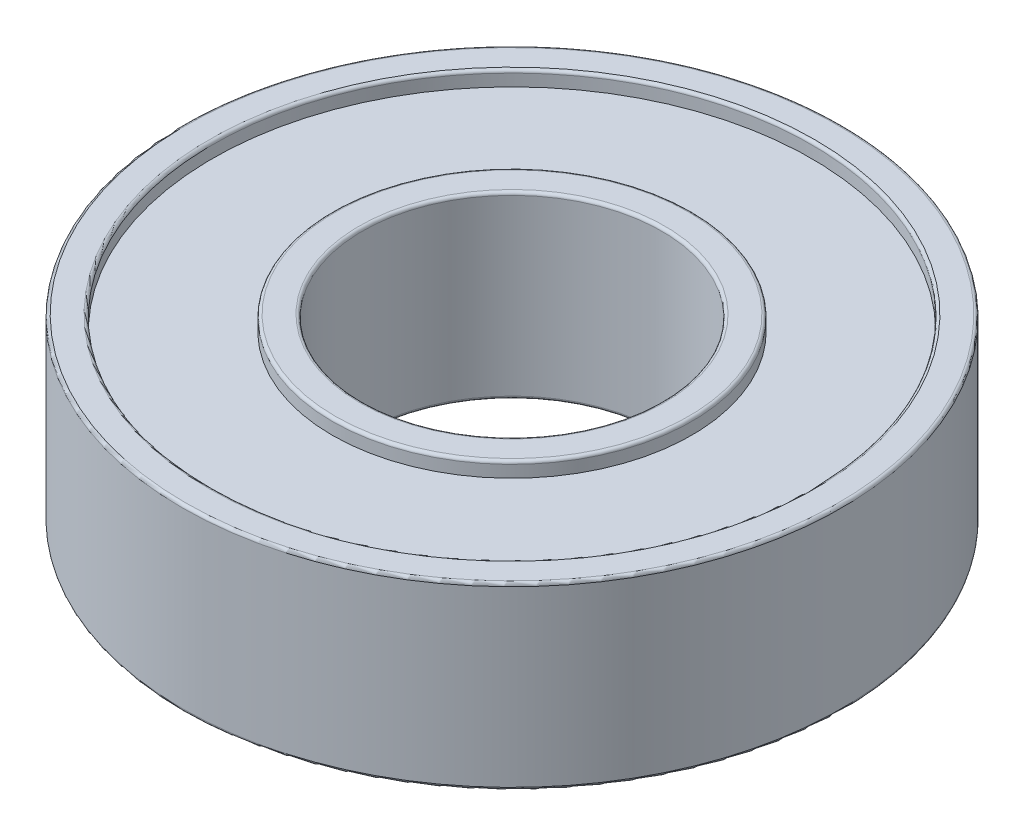
ISO-10303-21;
HEADER;
FILE_DESCRIPTION(('STEP AP214'),'2;1');
FILE_NAME('part.step','',(''),(''),'','','');
FILE_SCHEMA(('AUTOMOTIVE_DESIGN { 1 0 10303 214 1 1 1 1 }'));
ENDSEC;
DATA;
#1=APPLICATION_CONTEXT('core data for automotive mechanical design processes');
#2=APPLICATION_PROTOCOL_DEFINITION('international standard','automotive_design',2000,#1);
#3=PRODUCT_CONTEXT('',#1,'mechanical');
#4=PRODUCT('Part','Part','',(#3));
#5=PRODUCT_RELATED_PRODUCT_CATEGORY('part','',(#4));
#6=PRODUCT_DEFINITION_FORMATION('','',#4);
#7=PRODUCT_DEFINITION_CONTEXT('part definition',#1,'design');
#8=PRODUCT_DEFINITION('design','',#6,#7);
#9=PRODUCT_DEFINITION_SHAPE('','',#8);
#10=(LENGTH_UNIT() NAMED_UNIT(*) SI_UNIT(.MILLI.,.METRE.));
#11=(NAMED_UNIT(*) PLANE_ANGLE_UNIT() SI_UNIT($,.RADIAN.));
#12=(NAMED_UNIT(*) SI_UNIT($,.STERADIAN.) SOLID_ANGLE_UNIT());
#13=UNCERTAINTY_MEASURE_WITH_UNIT(LENGTH_MEASURE(1.E-05),#10,'distance_accuracy_value','');
#14=(GEOMETRIC_REPRESENTATION_CONTEXT(3) GLOBAL_UNCERTAINTY_ASSIGNED_CONTEXT((#13)) GLOBAL_UNIT_ASSIGNED_CONTEXT((#10,
#11,#12)) REPRESENTATION_CONTEXT('',''));
#15=CARTESIAN_POINT('',(0.,0.,0.));
#16=DIRECTION('',(0.,0.,1.));
#17=DIRECTION('',(1.,0.,0.));
#18=AXIS2_PLACEMENT_3D('',#15,#16,#17);
#19=CARTESIAN_POINT('',(0.,2.9,0.));
#20=DIRECTION('',(0.,1.,0.));
#21=DIRECTION('',(0.,0.,1.));
#22=AXIS2_PLACEMENT_3D('',#19,#20,#21);
#23=TOROIDAL_SURFACE('',#22,5.1,0.1);
#24=CARTESIAN_POINT('',(0.,3.,0.));
#25=DIRECTION('',(0.,1.,0.));
#26=DIRECTION('',(0.,0.,1.));
#27=AXIS2_PLACEMENT_3D('',#24,#25,#26);
#28=CIRCLE('',#27,5.1);
#29=CARTESIAN_POINT('',(0.,3.,5.1));
#30=VERTEX_POINT('',#29);
#31=EDGE_CURVE('E10',#30,#30,#28,.T.);
#32=ORIENTED_EDGE('',*,*,#31,.T.);
#33=EDGE_LOOP('',(#32));
#34=FACE_BOUND('',#33,.T.);
#35=CARTESIAN_POINT('',(0.,2.9,0.));
#36=DIRECTION('',(0.,1.,0.));
#37=DIRECTION('',(0.,0.,1.));
#38=AXIS2_PLACEMENT_3D('',#35,#36,#37);
#39=CIRCLE('',#38,5.);
#40=CARTESIAN_POINT('',(0.,2.9,5.));
#41=VERTEX_POINT('',#40);
#42=EDGE_CURVE('E101',#41,#41,#39,.T.);
#43=ORIENTED_EDGE('',*,*,#42,.F.);
#44=EDGE_LOOP('',(#43));
#45=FACE_BOUND('',#44,.T.);
#46=ADVANCED_FACE('F37',(#34,#45),#23,.T.);
#47=CARTESIAN_POINT('',(5.1,3.,0.));
#48=DIRECTION('',(0.,1.,0.));
#49=DIRECTION('',(0.,0.,1.));
#50=AXIS2_PLACEMENT_3D('',#47,#48,#49);
#51=PLANE('',#50);
#52=CARTESIAN_POINT('',(0.,3.,0.));
#53=DIRECTION('',(0.,1.,0.));
#54=DIRECTION('',(0.,0.,1.));
#55=AXIS2_PLACEMENT_3D('',#52,#53,#54);
#56=CIRCLE('',#55,5.9);
#57=CARTESIAN_POINT('',(0.,3.,5.9));
#58=VERTEX_POINT('',#57);
#59=EDGE_CURVE('E43',#58,#58,#56,.T.);
#60=ORIENTED_EDGE('',*,*,#59,.T.);
#61=EDGE_LOOP('',(#60));
#62=FACE_BOUND('',#61,.T.);
#63=ORIENTED_EDGE('',*,*,#31,.F.);
#64=EDGE_LOOP('',(#63));
#65=FACE_BOUND('',#64,.T.);
#66=ADVANCED_FACE('F109',(#62,#65),#51,.T.);
#67=CARTESIAN_POINT('',(0.,2.9,0.));
#68=DIRECTION('',(0.,1.,0.));
#69=DIRECTION('',(0.,0.,1.));
#70=AXIS2_PLACEMENT_3D('',#67,#68,#69);
#71=TOROIDAL_SURFACE('',#70,5.9,0.1);
#72=CARTESIAN_POINT('',(0.,2.9,0.));
#73=DIRECTION('',(0.,1.,0.));
#74=DIRECTION('',(0.,0.,1.));
#75=AXIS2_PLACEMENT_3D('',#72,#73,#74);
#76=CIRCLE('',#75,6.);
#77=CARTESIAN_POINT('',(0.,2.9,6.));
#78=VERTEX_POINT('',#77);
#79=EDGE_CURVE('E47',#78,#78,#76,.T.);
#80=ORIENTED_EDGE('',*,*,#79,.T.);
#81=EDGE_LOOP('',(#80));
#82=FACE_BOUND('',#81,.T.);
#83=ORIENTED_EDGE('',*,*,#59,.F.);
#84=EDGE_LOOP('',(#83));
#85=FACE_BOUND('',#84,.T.);
#86=ADVANCED_FACE('F113',(#82,#85),#71,.T.);
#87=CARTESIAN_POINT('',(0.,-3.,0.));
#88=DIRECTION('',(0.,1.,0.));
#89=DIRECTION('',(0.,0.,1.));
#90=AXIS2_PLACEMENT_3D('',#87,#88,#89);
#91=CYLINDRICAL_SURFACE('',#90,6.);
#92=CARTESIAN_POINT('',(0.,2.5,0.));
#93=DIRECTION('',(0.,1.,0.));
#94=DIRECTION('',(0.,0.,1.));
#95=AXIS2_PLACEMENT_3D('',#92,#93,#94);
#96=CIRCLE('',#95,6.);
#97=CARTESIAN_POINT('',(0.,2.5,6.));
#98=VERTEX_POINT('',#97);
#99=EDGE_CURVE('E51',#98,#98,#96,.T.);
#100=ORIENTED_EDGE('',*,*,#99,.T.);
#101=EDGE_LOOP('',(#100));
#102=FACE_BOUND('',#101,.T.);
#103=ORIENTED_EDGE('',*,*,#79,.F.);
#104=EDGE_LOOP('',(#103));
#105=FACE_BOUND('',#104,.T.);
#106=ADVANCED_FACE('F117',(#102,#105),#91,.T.);
#107=CARTESIAN_POINT('',(6.,2.5,0.));
#108=DIRECTION('',(0.,1.,0.));
#109=DIRECTION('',(0.,0.,1.));
#110=AXIS2_PLACEMENT_3D('',#107,#108,#109);
#111=PLANE('',#110);
#112=CARTESIAN_POINT('',(0.,2.5,0.));
#113=DIRECTION('',(0.,1.,0.));
#114=DIRECTION('',(0.,0.,1.));
#115=AXIS2_PLACEMENT_3D('',#112,#113,#114);
#116=CIRCLE('',#115,10.);
#117=CARTESIAN_POINT('',(0.,2.5,10.));
#118=VERTEX_POINT('',#117);
#119=EDGE_CURVE('E56',#118,#118,#116,.T.);
#120=ORIENTED_EDGE('',*,*,#119,.T.);
#121=EDGE_LOOP('',(#120));
#122=FACE_BOUND('',#121,.T.);
#123=ORIENTED_EDGE('',*,*,#99,.F.);
#124=EDGE_LOOP('',(#123));
#125=FACE_BOUND('',#124,.T.);
#126=ADVANCED_FACE('F124',(#122,#125),#111,.T.);
#127=CARTESIAN_POINT('',(0.,-3.,0.));
#128=DIRECTION('',(0.,1.,0.));
#129=DIRECTION('',(0.,0.,1.));
#130=AXIS2_PLACEMENT_3D('',#127,#128,#129);
#131=CYLINDRICAL_SURFACE('',#130,10.);
#132=CARTESIAN_POINT('',(0.,2.9,0.));
#133=DIRECTION('',(0.,1.,0.));
#134=DIRECTION('',(0.,0.,1.));
#135=AXIS2_PLACEMENT_3D('',#132,#133,#134);
#136=CIRCLE('',#135,10.);
#137=CARTESIAN_POINT('',(0.,2.9,10.));
#138=VERTEX_POINT('',#137);
#139=EDGE_CURVE('E59',#138,#138,#136,.T.);
#140=ORIENTED_EDGE('',*,*,#139,.T.);
#141=EDGE_LOOP('',(#140));
#142=FACE_BOUND('',#141,.T.);
#143=ORIENTED_EDGE('',*,*,#119,.F.);
#144=EDGE_LOOP('',(#143));
#145=FACE_BOUND('',#144,.T.);
#146=ADVANCED_FACE('F128',(#142,#145),#131,.F.);
#147=CARTESIAN_POINT('',(0.,2.9,0.));
#148=DIRECTION('',(0.,1.,0.));
#149=DIRECTION('',(0.,0.,1.));
#150=AXIS2_PLACEMENT_3D('',#147,#148,#149);
#151=TOROIDAL_SURFACE('',#150,10.1,0.0999999999999998);
#152=CARTESIAN_POINT('',(0.,3.,0.));
#153=DIRECTION('',(0.,1.,0.));
#154=DIRECTION('',(0.,0.,1.));
#155=AXIS2_PLACEMENT_3D('',#152,#153,#154);
#156=CIRCLE('',#155,10.1);
#157=CARTESIAN_POINT('',(0.,3.,10.1));
#158=VERTEX_POINT('',#157);
#159=EDGE_CURVE('E62',#158,#158,#156,.T.);
#160=ORIENTED_EDGE('',*,*,#159,.T.);
#161=EDGE_LOOP('',(#160));
#162=FACE_BOUND('',#161,.T.);
#163=ORIENTED_EDGE('',*,*,#139,.F.);
#164=EDGE_LOOP('',(#163));
#165=FACE_BOUND('',#164,.T.);
#166=ADVANCED_FACE('F132',(#162,#165),#151,.T.);
#167=CARTESIAN_POINT('',(10.1,3.,0.));
#168=DIRECTION('',(0.,1.,0.));
#169=DIRECTION('',(0.,0.,1.));
#170=AXIS2_PLACEMENT_3D('',#167,#168,#169);
#171=PLANE('',#170);
#172=CARTESIAN_POINT('',(0.,3.,0.));
#173=DIRECTION('',(0.,1.,0.));
#174=DIRECTION('',(0.,0.,1.));
#175=AXIS2_PLACEMENT_3D('',#172,#173,#174);
#176=CIRCLE('',#175,10.9);
#177=CARTESIAN_POINT('',(0.,3.,10.9));
#178=VERTEX_POINT('',#177);
#179=EDGE_CURVE('E65',#178,#178,#176,.T.);
#180=ORIENTED_EDGE('',*,*,#179,.T.);
#181=EDGE_LOOP('',(#180));
#182=FACE_BOUND('',#181,.T.);
#183=ORIENTED_EDGE('',*,*,#159,.F.);
#184=EDGE_LOOP('',(#183));
#185=FACE_BOUND('',#184,.T.);
#186=ADVANCED_FACE('F136',(#182,#185),#171,.T.);
#187=CARTESIAN_POINT('',(0.,2.9,0.));
#188=DIRECTION('',(0.,1.,0.));
#189=DIRECTION('',(0.,0.,1.));
#190=AXIS2_PLACEMENT_3D('',#187,#188,#189);
#191=TOROIDAL_SURFACE('',#190,10.9,0.0999999999999998);
#192=CARTESIAN_POINT('',(0.,2.9,0.));
#193=DIRECTION('',(0.,1.,0.));
#194=DIRECTION('',(0.,0.,1.));
#195=AXIS2_PLACEMENT_3D('',#192,#193,#194);
#196=CIRCLE('',#195,11.);
#197=CARTESIAN_POINT('',(0.,2.9,11.));
#198=VERTEX_POINT('',#197);
#199=EDGE_CURVE('E68',#198,#198,#196,.T.);
#200=ORIENTED_EDGE('',*,*,#199,.T.);
#201=EDGE_LOOP('',(#200));
#202=FACE_BOUND('',#201,.T.);
#203=ORIENTED_EDGE('',*,*,#179,.F.);
#204=EDGE_LOOP('',(#203));
#205=FACE_BOUND('',#204,.T.);
#206=ADVANCED_FACE('F140',(#202,#205),#191,.T.);
#207=CARTESIAN_POINT('',(0.,-3.,0.));
#208=DIRECTION('',(0.,1.,0.));
#209=DIRECTION('',(0.,0.,1.));
#210=AXIS2_PLACEMENT_3D('',#207,#208,#209);
#211=CYLINDRICAL_SURFACE('',#210,11.);
#212=CARTESIAN_POINT('',(0.,-2.9,0.));
#213=DIRECTION('',(0.,1.,0.));
#214=DIRECTION('',(0.,0.,1.));
#215=AXIS2_PLACEMENT_3D('',#212,#213,#214);
#216=CIRCLE('',#215,11.);
#217=CARTESIAN_POINT('',(0.,-2.9,11.));
#218=VERTEX_POINT('',#217);
#219=EDGE_CURVE('E71',#218,#218,#216,.T.);
#220=ORIENTED_EDGE('',*,*,#219,.T.);
#221=EDGE_LOOP('',(#220));
#222=FACE_BOUND('',#221,.T.);
#223=ORIENTED_EDGE('',*,*,#199,.F.);
#224=EDGE_LOOP('',(#223));
#225=FACE_BOUND('',#224,.T.);
#226=ADVANCED_FACE('F144',(#222,#225),#211,.T.);
#227=CARTESIAN_POINT('',(0.,-2.9,0.));
#228=DIRECTION('',(0.,1.,0.));
#229=DIRECTION('',(0.,0.,1.));
#230=AXIS2_PLACEMENT_3D('',#227,#228,#229);
#231=TOROIDAL_SURFACE('',#230,10.9,0.0999999999999998);
#232=CARTESIAN_POINT('',(0.,-3.,0.));
#233=DIRECTION('',(0.,1.,0.));
#234=DIRECTION('',(0.,0.,1.));
#235=AXIS2_PLACEMENT_3D('',#232,#233,#234);
#236=CIRCLE('',#235,10.9);
#237=CARTESIAN_POINT('',(0.,-3.,10.9));
#238=VERTEX_POINT('',#237);
#239=EDGE_CURVE('E74',#238,#238,#236,.T.);
#240=ORIENTED_EDGE('',*,*,#239,.T.);
#241=EDGE_LOOP('',(#240));
#242=FACE_BOUND('',#241,.T.);
#243=ORIENTED_EDGE('',*,*,#219,.F.);
#244=EDGE_LOOP('',(#243));
#245=FACE_BOUND('',#244,.T.);
#246=ADVANCED_FACE('F148',(#242,#245),#231,.T.);
#247=CARTESIAN_POINT('',(10.9,-3.,0.));
#248=DIRECTION('',(0.,-1.,0.));
#249=DIRECTION('',(0.,0.,-1.));
#250=AXIS2_PLACEMENT_3D('',#247,#248,#249);
#251=PLANE('',#250);
#252=CARTESIAN_POINT('',(0.,-3.,0.));
#253=DIRECTION('',(0.,1.,0.));
#254=DIRECTION('',(0.,0.,1.));
#255=AXIS2_PLACEMENT_3D('',#252,#253,#254);
#256=CIRCLE('',#255,10.1);
#257=CARTESIAN_POINT('',(0.,-3.,10.1));
#258=VERTEX_POINT('',#257);
#259=EDGE_CURVE('E77',#258,#258,#256,.T.);
#260=ORIENTED_EDGE('',*,*,#259,.T.);
#261=EDGE_LOOP('',(#260));
#262=FACE_BOUND('',#261,.T.);
#263=ORIENTED_EDGE('',*,*,#239,.F.);
#264=EDGE_LOOP('',(#263));
#265=FACE_BOUND('',#264,.T.);
#266=ADVANCED_FACE('F152',(#262,#265),#251,.T.);
#267=CARTESIAN_POINT('',(0.,-2.9,0.));
#268=DIRECTION('',(0.,1.,0.));
#269=DIRECTION('',(0.,0.,1.));
#270=AXIS2_PLACEMENT_3D('',#267,#268,#269);
#271=TOROIDAL_SURFACE('',#270,10.1,0.0999999999999998);
#272=CARTESIAN_POINT('',(0.,-2.9,0.));
#273=DIRECTION('',(0.,1.,0.));
#274=DIRECTION('',(0.,0.,1.));
#275=AXIS2_PLACEMENT_3D('',#272,#273,#274);
#276=CIRCLE('',#275,10.);
#277=CARTESIAN_POINT('',(0.,-2.9,10.));
#278=VERTEX_POINT('',#277);
#279=EDGE_CURVE('E80',#278,#278,#276,.T.);
#280=ORIENTED_EDGE('',*,*,#279,.T.);
#281=EDGE_LOOP('',(#280));
#282=FACE_BOUND('',#281,.T.);
#283=ORIENTED_EDGE('',*,*,#259,.F.);
#284=EDGE_LOOP('',(#283));
#285=FACE_BOUND('',#284,.T.);
#286=ADVANCED_FACE('F156',(#282,#285),#271,.T.);
#287=CARTESIAN_POINT('',(0.,-3.,0.));
#288=DIRECTION('',(0.,1.,0.));
#289=DIRECTION('',(0.,0.,1.));
#290=AXIS2_PLACEMENT_3D('',#287,#288,#289);
#291=CYLINDRICAL_SURFACE('',#290,10.);
#292=CARTESIAN_POINT('',(0.,-2.5,0.));
#293=DIRECTION('',(0.,1.,0.));
#294=DIRECTION('',(0.,0.,1.));
#295=AXIS2_PLACEMENT_3D('',#292,#293,#294);
#296=CIRCLE('',#295,10.);
#297=CARTESIAN_POINT('',(0.,-2.5,10.));
#298=VERTEX_POINT('',#297);
#299=EDGE_CURVE('E83',#298,#298,#296,.T.);
#300=ORIENTED_EDGE('',*,*,#299,.T.);
#301=EDGE_LOOP('',(#300));
#302=FACE_BOUND('',#301,.T.);
#303=ORIENTED_EDGE('',*,*,#279,.F.);
#304=EDGE_LOOP('',(#303));
#305=FACE_BOUND('',#304,.T.);
#306=ADVANCED_FACE('F160',(#302,#305),#291,.F.);
#307=CARTESIAN_POINT('',(10.,-2.5,0.));
#308=DIRECTION('',(0.,-1.,0.));
#309=DIRECTION('',(0.,0.,-1.));
#310=AXIS2_PLACEMENT_3D('',#307,#308,#309);
#311=PLANE('',#310);
#312=CARTESIAN_POINT('',(0.,-2.5,0.));
#313=DIRECTION('',(0.,1.,0.));
#314=DIRECTION('',(0.,0.,1.));
#315=AXIS2_PLACEMENT_3D('',#312,#313,#314);
#316=CIRCLE('',#315,6.);
#317=CARTESIAN_POINT('',(0.,-2.5,6.));
#318=VERTEX_POINT('',#317);
#319=EDGE_CURVE('E86',#318,#318,#316,.T.);
#320=ORIENTED_EDGE('',*,*,#319,.T.);
#321=EDGE_LOOP('',(#320));
#322=FACE_BOUND('',#321,.T.);
#323=ORIENTED_EDGE('',*,*,#299,.F.);
#324=EDGE_LOOP('',(#323));
#325=FACE_BOUND('',#324,.T.);
#326=ADVANCED_FACE('F164',(#322,#325),#311,.T.);
#327=CARTESIAN_POINT('',(0.,-3.,0.));
#328=DIRECTION('',(0.,1.,0.));
#329=DIRECTION('',(0.,0.,1.));
#330=AXIS2_PLACEMENT_3D('',#327,#328,#329);
#331=CYLINDRICAL_SURFACE('',#330,6.);
#332=CARTESIAN_POINT('',(0.,-2.9,0.));
#333=DIRECTION('',(0.,1.,0.));
#334=DIRECTION('',(0.,0.,1.));
#335=AXIS2_PLACEMENT_3D('',#332,#333,#334);
#336=CIRCLE('',#335,6.);
#337=CARTESIAN_POINT('',(0.,-2.9,6.));
#338=VERTEX_POINT('',#337);
#339=EDGE_CURVE('E89',#338,#338,#336,.T.);
#340=ORIENTED_EDGE('',*,*,#339,.T.);
#341=EDGE_LOOP('',(#340));
#342=FACE_BOUND('',#341,.T.);
#343=ORIENTED_EDGE('',*,*,#319,.F.);
#344=EDGE_LOOP('',(#343));
#345=FACE_BOUND('',#344,.T.);
#346=ADVANCED_FACE('F168',(#342,#345),#331,.T.);
#347=CARTESIAN_POINT('',(0.,-2.9,0.));
#348=DIRECTION('',(0.,1.,0.));
#349=DIRECTION('',(0.,0.,1.));
#350=AXIS2_PLACEMENT_3D('',#347,#348,#349);
#351=TOROIDAL_SURFACE('',#350,5.9,0.1);
#352=CARTESIAN_POINT('',(0.,-3.,0.));
#353=DIRECTION('',(0.,1.,0.));
#354=DIRECTION('',(0.,0.,1.));
#355=AXIS2_PLACEMENT_3D('',#352,#353,#354);
#356=CIRCLE('',#355,5.9);
#357=CARTESIAN_POINT('',(0.,-3.,5.9));
#358=VERTEX_POINT('',#357);
#359=EDGE_CURVE('E92',#358,#358,#356,.T.);
#360=ORIENTED_EDGE('',*,*,#359,.T.);
#361=EDGE_LOOP('',(#360));
#362=FACE_BOUND('',#361,.T.);
#363=ORIENTED_EDGE('',*,*,#339,.F.);
#364=EDGE_LOOP('',(#363));
#365=FACE_BOUND('',#364,.T.);
#366=ADVANCED_FACE('F172',(#362,#365),#351,.T.);
#367=CARTESIAN_POINT('',(5.9,-3.,0.));
#368=DIRECTION('',(0.,-1.,0.));
#369=DIRECTION('',(0.,0.,-1.));
#370=AXIS2_PLACEMENT_3D('',#367,#368,#369);
#371=PLANE('',#370);
#372=CARTESIAN_POINT('',(0.,-3.,0.));
#373=DIRECTION('',(0.,1.,0.));
#374=DIRECTION('',(0.,0.,1.));
#375=AXIS2_PLACEMENT_3D('',#372,#373,#374);
#376=CIRCLE('',#375,5.1);
#377=CARTESIAN_POINT('',(0.,-3.,5.1));
#378=VERTEX_POINT('',#377);
#379=EDGE_CURVE('E95',#378,#378,#376,.T.);
#380=ORIENTED_EDGE('',*,*,#379,.T.);
#381=EDGE_LOOP('',(#380));
#382=FACE_BOUND('',#381,.T.);
#383=ORIENTED_EDGE('',*,*,#359,.F.);
#384=EDGE_LOOP('',(#383));
#385=FACE_BOUND('',#384,.T.);
#386=ADVANCED_FACE('F176',(#382,#385),#371,.T.);
#387=CARTESIAN_POINT('',(0.,-2.9,0.));
#388=DIRECTION('',(0.,1.,0.));
#389=DIRECTION('',(0.,0.,1.));
#390=AXIS2_PLACEMENT_3D('',#387,#388,#389);
#391=TOROIDAL_SURFACE('',#390,5.1,0.1);
#392=CARTESIAN_POINT('',(0.,-2.9,0.));
#393=DIRECTION('',(0.,1.,0.));
#394=DIRECTION('',(0.,0.,1.));
#395=AXIS2_PLACEMENT_3D('',#392,#393,#394);
#396=CIRCLE('',#395,5.);
#397=CARTESIAN_POINT('',(0.,-2.9,5.));
#398=VERTEX_POINT('',#397);
#399=EDGE_CURVE('E98',#398,#398,#396,.T.);
#400=ORIENTED_EDGE('',*,*,#399,.T.);
#401=EDGE_LOOP('',(#400));
#402=FACE_BOUND('',#401,.T.);
#403=ORIENTED_EDGE('',*,*,#379,.F.);
#404=EDGE_LOOP('',(#403));
#405=FACE_BOUND('',#404,.T.);
#406=ADVANCED_FACE('F180',(#402,#405),#391,.T.);
#407=CARTESIAN_POINT('',(0.,-3.,0.));
#408=DIRECTION('',(0.,1.,0.));
#409=DIRECTION('',(0.,0.,1.));
#410=AXIS2_PLACEMENT_3D('',#407,#408,#409);
#411=CYLINDRICAL_SURFACE('',#410,5.);
#412=ORIENTED_EDGE('',*,*,#42,.T.);
#413=EDGE_LOOP('',(#412));
#414=FACE_BOUND('',#413,.T.);
#415=ORIENTED_EDGE('',*,*,#399,.F.);
#416=EDGE_LOOP('',(#415));
#417=FACE_BOUND('',#416,.T.);
#418=ADVANCED_FACE('F105',(#414,#417),#411,.F.);
#419=CLOSED_SHELL('',(#46,#66,#86,#106,#126,#146,#166,#186,#206,#226,#246,#266,#286,#306,#326,
#346,#366,#386,#406,#418));
#420=MANIFOLD_SOLID_BREP('B2',#419);
#421=ADVANCED_BREP_SHAPE_REPRESENTATION('',(#18,#420),#14);
#422=SHAPE_DEFINITION_REPRESENTATION(#9,#421);
ENDSEC;
END-ISO-10303-21;
